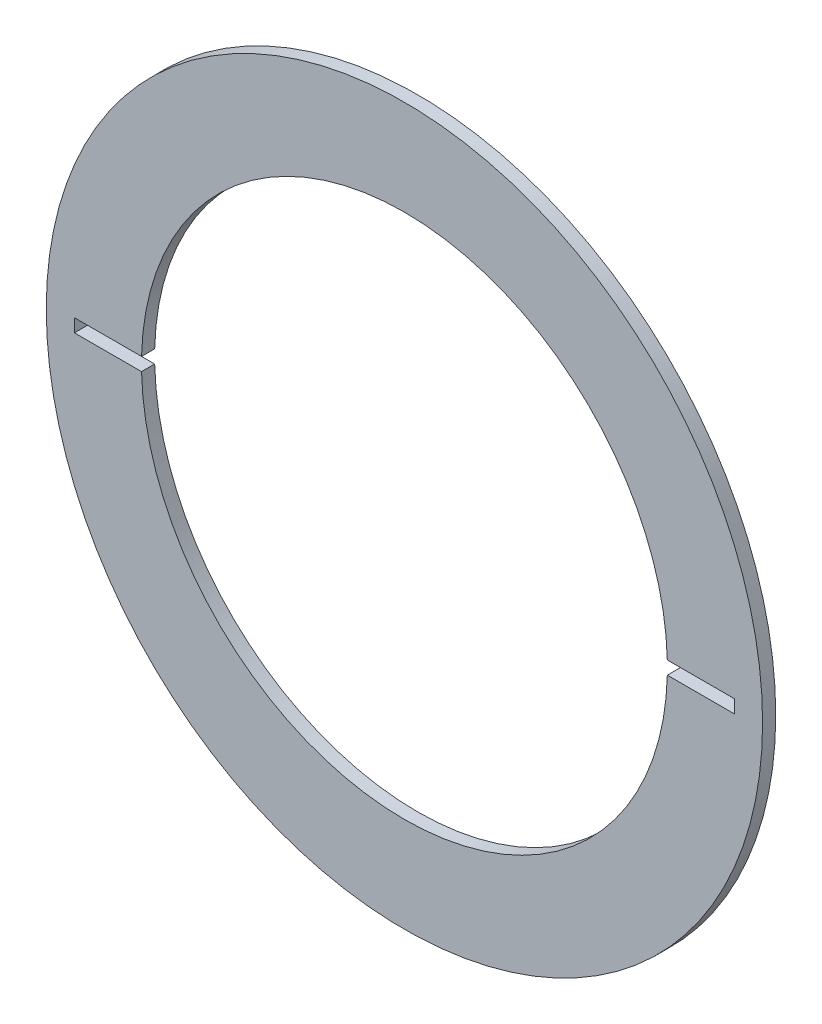
ISO-10303-21;
HEADER;
FILE_DESCRIPTION(('STEP AP214'),'2;1');
FILE_NAME('part.step','',(''),(''),'','','');
FILE_SCHEMA(('AUTOMOTIVE_DESIGN { 1 0 10303 214 1 1 1 1 }'));
ENDSEC;
DATA;
#1=APPLICATION_CONTEXT('core data for automotive mechanical design processes');
#2=APPLICATION_PROTOCOL_DEFINITION('international standard','automotive_design',2000,#1);
#3=PRODUCT_CONTEXT('',#1,'mechanical');
#4=PRODUCT('Part','Part','',(#3));
#5=PRODUCT_RELATED_PRODUCT_CATEGORY('part','',(#4));
#6=PRODUCT_DEFINITION_FORMATION('','',#4);
#7=PRODUCT_DEFINITION_CONTEXT('part definition',#1,'design');
#8=PRODUCT_DEFINITION('design','',#6,#7);
#9=PRODUCT_DEFINITION_SHAPE('','',#8);
#10=(LENGTH_UNIT() NAMED_UNIT(*) SI_UNIT(.MILLI.,.METRE.));
#11=(NAMED_UNIT(*) PLANE_ANGLE_UNIT() SI_UNIT($,.RADIAN.));
#12=(NAMED_UNIT(*) SI_UNIT($,.STERADIAN.) SOLID_ANGLE_UNIT());
#13=UNCERTAINTY_MEASURE_WITH_UNIT(LENGTH_MEASURE(1.E-05),#10,'distance_accuracy_value','');
#14=(GEOMETRIC_REPRESENTATION_CONTEXT(3) GLOBAL_UNCERTAINTY_ASSIGNED_CONTEXT((#13)) GLOBAL_UNIT_ASSIGNED_CONTEXT((#10,
#11,#12)) REPRESENTATION_CONTEXT('',''));
#15=CARTESIAN_POINT('',(0.,0.,0.));
#16=DIRECTION('',(0.,0.,1.));
#17=DIRECTION('',(1.,0.,0.));
#18=AXIS2_PLACEMENT_3D('',#15,#16,#17);
#19=CARTESIAN_POINT('',(0.,0.,1.5875));
#20=DIRECTION('',(0.,0.,-1.));
#21=DIRECTION('',(-1.,0.,0.));
#22=AXIS2_PLACEMENT_3D('',#19,#20,#21);
#23=CYLINDRICAL_SURFACE('',#22,31.75);
#24=CARTESIAN_POINT('',(0.,0.,0.));
#25=DIRECTION('',(0.,0.,1.));
#26=DIRECTION('',(1.,0.,0.));
#27=AXIS2_PLACEMENT_3D('',#24,#25,#26);
#28=CIRCLE('',#27,31.75);
#29=CARTESIAN_POINT('',(31.7400765742224,0.793750000000004,0.));
#30=VERTEX_POINT('',#29);
#31=CARTESIAN_POINT('',(-31.7400765742224,0.793749999999996,0.));
#32=VERTEX_POINT('',#31);
#33=EDGE_CURVE('E134',#30,#32,#28,.T.);
#34=ORIENTED_EDGE('',*,*,#33,.F.);
#35=DIRECTION('',(0.,0.,-1.));
#36=VECTOR('',#35,1.);
#37=CARTESIAN_POINT('',(31.7400765742224,0.793750000000004,1.5875));
#38=LINE('',#37,#36);
#39=CARTESIAN_POINT('',(31.7400765742224,0.793750000000004,1.5875));
#40=VERTEX_POINT('',#39);
#41=EDGE_CURVE('E11',#40,#30,#38,.T.);
#42=ORIENTED_EDGE('',*,*,#41,.F.);
#43=CARTESIAN_POINT('',(0.,0.,1.5875));
#44=DIRECTION('',(0.,0.,1.));
#45=DIRECTION('',(1.,0.,0.));
#46=AXIS2_PLACEMENT_3D('',#43,#44,#45);
#47=CIRCLE('',#46,31.75);
#48=CARTESIAN_POINT('',(-31.7400765742224,0.793749999999996,1.5875));
#49=VERTEX_POINT('',#48);
#50=EDGE_CURVE('E152',#40,#49,#47,.T.);
#51=ORIENTED_EDGE('',*,*,#50,.T.);
#52=DIRECTION('',(0.,0.,-1.));
#53=VECTOR('',#52,1.);
#54=CARTESIAN_POINT('',(-31.7400765742224,0.793749999999996,1.5875));
#55=LINE('',#54,#53);
#56=EDGE_CURVE('E52',#49,#32,#55,.T.);
#57=ORIENTED_EDGE('',*,*,#56,.T.);
#58=EDGE_LOOP('',(#34,#42,#51,#57));
#59=FACE_BOUND('',#58,.T.);
#60=ADVANCED_FACE('F35',(#59),#23,.F.);
#61=CARTESIAN_POINT('',(0.,0.79375,1.5875));
#62=DIRECTION('',(0.,-1.,0.));
#63=DIRECTION('',(1.,0.,0.));
#64=AXIS2_PLACEMENT_3D('',#61,#62,#63);
#65=PLANE('',#64);
#66=DIRECTION('',(-1.,0.,0.));
#67=VECTOR('',#66,1.);
#68=CARTESIAN_POINT('',(0.,0.79375,0.));
#69=LINE('',#68,#67);
#70=CARTESIAN_POINT('',(39.84498,0.793750000000005,0.));
#71=VERTEX_POINT('',#70);
#72=EDGE_CURVE('E136',#71,#30,#69,.T.);
#73=ORIENTED_EDGE('',*,*,#72,.F.);
#74=DIRECTION('',(0.,0.,-1.));
#75=VECTOR('',#74,1.);
#76=CARTESIAN_POINT('',(39.84498,0.793750000000005,1.5875));
#77=LINE('',#76,#75);
#78=CARTESIAN_POINT('',(39.84498,0.793750000000005,1.5875));
#79=VERTEX_POINT('',#78);
#80=EDGE_CURVE('E44',#79,#71,#77,.T.);
#81=ORIENTED_EDGE('',*,*,#80,.F.);
#82=DIRECTION('',(-1.,0.,0.));
#83=VECTOR('',#82,1.);
#84=CARTESIAN_POINT('',(0.,0.79375,1.5875));
#85=LINE('',#84,#83);
#86=EDGE_CURVE('E129',#79,#40,#85,.T.);
#87=ORIENTED_EDGE('',*,*,#86,.T.);
#88=ORIENTED_EDGE('',*,*,#41,.T.);
#89=EDGE_LOOP('',(#73,#81,#87,#88));
#90=FACE_BOUND('',#89,.T.);
#91=ADVANCED_FACE('F168',(#90),#65,.T.);
#92=CARTESIAN_POINT('',(39.84498,0.,1.5875));
#93=DIRECTION('',(-1.,0.,0.));
#94=DIRECTION('',(0.,0.,1.));
#95=AXIS2_PLACEMENT_3D('',#92,#93,#94);
#96=PLANE('',#95);
#97=DIRECTION('',(0.,1.,0.));
#98=VECTOR('',#97,1.);
#99=CARTESIAN_POINT('',(39.84498,0.,0.));
#100=LINE('',#99,#98);
#101=CARTESIAN_POINT('',(39.84498,-0.793749999999995,0.));
#102=VERTEX_POINT('',#101);
#103=EDGE_CURVE('E140',#102,#71,#100,.T.);
#104=ORIENTED_EDGE('',*,*,#103,.F.);
#105=DIRECTION('',(0.,0.,-1.));
#106=VECTOR('',#105,1.);
#107=CARTESIAN_POINT('',(39.84498,-0.793749999999995,1.5875));
#108=LINE('',#107,#106);
#109=CARTESIAN_POINT('',(39.84498,-0.793749999999995,1.5875));
#110=VERTEX_POINT('',#109);
#111=EDGE_CURVE('E158',#110,#102,#108,.T.);
#112=ORIENTED_EDGE('',*,*,#111,.F.);
#113=DIRECTION('',(0.,1.,0.));
#114=VECTOR('',#113,1.);
#115=CARTESIAN_POINT('',(39.84498,0.,1.5875));
#116=LINE('',#115,#114);
#117=EDGE_CURVE('E164',#110,#79,#116,.T.);
#118=ORIENTED_EDGE('',*,*,#117,.T.);
#119=ORIENTED_EDGE('',*,*,#80,.T.);
#120=EDGE_LOOP('',(#104,#112,#118,#119));
#121=FACE_BOUND('',#120,.T.);
#122=ADVANCED_FACE('F37',(#121),#96,.T.);
#123=CARTESIAN_POINT('',(0.,-0.79375,1.5875));
#124=DIRECTION('',(0.,-1.,0.));
#125=DIRECTION('',(1.,0.,0.));
#126=AXIS2_PLACEMENT_3D('',#123,#124,#125);
#127=PLANE('',#126);
#128=DIRECTION('',(-1.,0.,0.));
#129=VECTOR('',#128,1.);
#130=CARTESIAN_POINT('',(0.,-0.79375,0.));
#131=LINE('',#130,#129);
#132=CARTESIAN_POINT('',(31.7400765742224,-0.793749999999996,0.));
#133=VERTEX_POINT('',#132);
#134=EDGE_CURVE('E144',#102,#133,#131,.T.);
#135=ORIENTED_EDGE('',*,*,#134,.T.);
#136=DIRECTION('',(0.,0.,-1.));
#137=VECTOR('',#136,1.);
#138=CARTESIAN_POINT('',(31.7400765742224,-0.793749999999996,1.5875));
#139=LINE('',#138,#137);
#140=CARTESIAN_POINT('',(31.7400765742224,-0.793749999999996,1.5875));
#141=VERTEX_POINT('',#140);
#142=EDGE_CURVE('E156',#141,#133,#139,.T.);
#143=ORIENTED_EDGE('',*,*,#142,.F.);
#144=DIRECTION('',(-1.,0.,0.));
#145=VECTOR('',#144,1.);
#146=CARTESIAN_POINT('',(0.,-0.79375,1.5875));
#147=LINE('',#146,#145);
#148=EDGE_CURVE('E114',#110,#141,#147,.T.);
#149=ORIENTED_EDGE('',*,*,#148,.F.);
#150=ORIENTED_EDGE('',*,*,#111,.T.);
#151=EDGE_LOOP('',(#135,#143,#149,#150));
#152=FACE_BOUND('',#151,.T.);
#153=ADVANCED_FACE('F177',(#152),#127,.F.);
#154=CARTESIAN_POINT('',(-31.7400765742224,-0.793750000000004,0.));
#155=VERTEX_POINT('',#154);
#156=EDGE_CURVE('E137',#155,#133,#28,.T.);
#157=ORIENTED_EDGE('',*,*,#156,.F.);
#158=DIRECTION('',(0.,0.,-1.));
#159=VECTOR('',#158,1.);
#160=CARTESIAN_POINT('',(-31.7400765742224,-0.793750000000004,1.5875));
#161=LINE('',#160,#159);
#162=CARTESIAN_POINT('',(-31.7400765742224,-0.793750000000004,1.5875));
#163=VERTEX_POINT('',#162);
#164=EDGE_CURVE('E122',#163,#155,#161,.T.);
#165=ORIENTED_EDGE('',*,*,#164,.F.);
#166=EDGE_CURVE('E111',#163,#141,#47,.T.);
#167=ORIENTED_EDGE('',*,*,#166,.T.);
#168=ORIENTED_EDGE('',*,*,#142,.T.);
#169=EDGE_LOOP('',(#157,#165,#167,#168));
#170=FACE_BOUND('',#169,.T.);
#171=ADVANCED_FACE('F181',(#170),#23,.F.);
#172=CARTESIAN_POINT('',(-39.84498,-0.793750000000005,0.));
#173=VERTEX_POINT('',#172);
#174=EDGE_CURVE('E119',#155,#173,#131,.T.);
#175=ORIENTED_EDGE('',*,*,#174,.T.);
#176=DIRECTION('',(0.,0.,-1.));
#177=VECTOR('',#176,1.);
#178=CARTESIAN_POINT('',(-39.84498,-0.793750000000005,1.5875));
#179=LINE('',#178,#177);
#180=CARTESIAN_POINT('',(-39.84498,-0.793750000000005,1.5875));
#181=VERTEX_POINT('',#180);
#182=EDGE_CURVE('E116',#181,#173,#179,.T.);
#183=ORIENTED_EDGE('',*,*,#182,.F.);
#184=EDGE_CURVE('E103',#163,#181,#147,.T.);
#185=ORIENTED_EDGE('',*,*,#184,.F.);
#186=ORIENTED_EDGE('',*,*,#164,.T.);
#187=EDGE_LOOP('',(#175,#183,#185,#186));
#188=FACE_BOUND('',#187,.T.);
#189=ADVANCED_FACE('F117',(#188),#127,.F.);
#190=CARTESIAN_POINT('',(-39.84498,0.,1.5875));
#191=DIRECTION('',(-1.,0.,0.));
#192=DIRECTION('',(0.,0.,1.));
#193=AXIS2_PLACEMENT_3D('',#190,#191,#192);
#194=PLANE('',#193);
#195=DIRECTION('',(0.,1.,0.));
#196=VECTOR('',#195,1.);
#197=CARTESIAN_POINT('',(-39.84498,0.,0.));
#198=LINE('',#197,#196);
#199=CARTESIAN_POINT('',(-39.84498,0.793749999999995,0.));
#200=VERTEX_POINT('',#199);
#201=EDGE_CURVE('E147',#173,#200,#198,.T.);
#202=ORIENTED_EDGE('',*,*,#201,.T.);
#203=DIRECTION('',(0.,0.,-1.));
#204=VECTOR('',#203,1.);
#205=CARTESIAN_POINT('',(-39.84498,0.793749999999995,1.5875));
#206=LINE('',#205,#204);
#207=CARTESIAN_POINT('',(-39.84498,0.793749999999995,1.5875));
#208=VERTEX_POINT('',#207);
#209=EDGE_CURVE('E78',#208,#200,#206,.T.);
#210=ORIENTED_EDGE('',*,*,#209,.F.);
#211=DIRECTION('',(0.,1.,0.));
#212=VECTOR('',#211,1.);
#213=CARTESIAN_POINT('',(-39.84498,0.,1.5875));
#214=LINE('',#213,#212);
#215=EDGE_CURVE('E109',#181,#208,#214,.T.);
#216=ORIENTED_EDGE('',*,*,#215,.F.);
#217=ORIENTED_EDGE('',*,*,#182,.T.);
#218=EDGE_LOOP('',(#202,#210,#216,#217));
#219=FACE_BOUND('',#218,.T.);
#220=ADVANCED_FACE('F124',(#219),#194,.F.);
#221=EDGE_CURVE('E141',#32,#200,#69,.T.);
#222=ORIENTED_EDGE('',*,*,#221,.F.);
#223=ORIENTED_EDGE('',*,*,#56,.F.);
#224=EDGE_CURVE('E125',#49,#208,#85,.T.);
#225=ORIENTED_EDGE('',*,*,#224,.T.);
#226=ORIENTED_EDGE('',*,*,#209,.T.);
#227=EDGE_LOOP('',(#222,#223,#225,#226));
#228=FACE_BOUND('',#227,.T.);
#229=ADVANCED_FACE('F183',(#228),#65,.T.);
#230=CARTESIAN_POINT('',(0.,0.,1.5875));
#231=DIRECTION('',(0.,0.,-1.));
#232=DIRECTION('',(-1.,0.,0.));
#233=AXIS2_PLACEMENT_3D('',#230,#231,#232);
#234=CYLINDRICAL_SURFACE('',#233,43.2435);
#235=CARTESIAN_POINT('',(0.,0.,1.5875));
#236=DIRECTION('',(0.,0.,1.));
#237=DIRECTION('',(1.,0.,0.));
#238=AXIS2_PLACEMENT_3D('',#235,#236,#237);
#239=CIRCLE('',#238,43.2435);
#240=CARTESIAN_POINT('',(43.2435,0.,1.5875));
#241=VERTEX_POINT('',#240);
#242=EDGE_CURVE('E127',#241,#241,#239,.T.);
#243=ORIENTED_EDGE('',*,*,#242,.F.);
#244=EDGE_LOOP('',(#243));
#245=FACE_BOUND('',#244,.T.);
#246=CARTESIAN_POINT('',(0.,0.,0.));
#247=DIRECTION('',(0.,0.,1.));
#248=DIRECTION('',(1.,0.,0.));
#249=AXIS2_PLACEMENT_3D('',#246,#247,#248);
#250=CIRCLE('',#249,43.2435);
#251=CARTESIAN_POINT('',(43.2435,0.,0.));
#252=VERTEX_POINT('',#251);
#253=EDGE_CURVE('E149',#252,#252,#250,.T.);
#254=ORIENTED_EDGE('',*,*,#253,.T.);
#255=EDGE_LOOP('',(#254));
#256=FACE_BOUND('',#255,.T.);
#257=ADVANCED_FACE('F185',(#245,#256),#234,.T.);
#258=CARTESIAN_POINT('',(0.,0.,1.5875));
#259=DIRECTION('',(0.,0.,1.));
#260=DIRECTION('',(1.,0.,0.));
#261=AXIS2_PLACEMENT_3D('',#258,#259,#260);
#262=PLANE('',#261);
#263=ORIENTED_EDGE('',*,*,#50,.F.);
#264=ORIENTED_EDGE('',*,*,#86,.F.);
#265=ORIENTED_EDGE('',*,*,#117,.F.);
#266=ORIENTED_EDGE('',*,*,#148,.T.);
#267=ORIENTED_EDGE('',*,*,#166,.F.);
#268=ORIENTED_EDGE('',*,*,#184,.T.);
#269=ORIENTED_EDGE('',*,*,#215,.T.);
#270=ORIENTED_EDGE('',*,*,#224,.F.);
#271=EDGE_LOOP('',(#263,#264,#265,#266,#267,#268,#269,#270));
#272=FACE_BOUND('',#271,.T.);
#273=ORIENTED_EDGE('',*,*,#242,.T.);
#274=EDGE_LOOP('',(#273));
#275=FACE_BOUND('',#274,.T.);
#276=ADVANCED_FACE('F105',(#272,#275),#262,.T.);
#277=CARTESIAN_POINT('',(0.,0.,0.));
#278=DIRECTION('',(0.,0.,1.));
#279=DIRECTION('',(1.,0.,0.));
#280=AXIS2_PLACEMENT_3D('',#277,#278,#279);
#281=PLANE('',#280);
#282=ORIENTED_EDGE('',*,*,#33,.T.);
#283=ORIENTED_EDGE('',*,*,#221,.T.);
#284=ORIENTED_EDGE('',*,*,#201,.F.);
#285=ORIENTED_EDGE('',*,*,#174,.F.);
#286=ORIENTED_EDGE('',*,*,#156,.T.);
#287=ORIENTED_EDGE('',*,*,#134,.F.);
#288=ORIENTED_EDGE('',*,*,#103,.T.);
#289=ORIENTED_EDGE('',*,*,#72,.T.);
#290=EDGE_LOOP('',(#282,#283,#284,#285,#286,#287,#288,#289));
#291=FACE_BOUND('',#290,.T.);
#292=ORIENTED_EDGE('',*,*,#253,.F.);
#293=EDGE_LOOP('',(#292));
#294=FACE_BOUND('',#293,.T.);
#295=ADVANCED_FACE('F171',(#291,#294),#281,.F.);
#296=CLOSED_SHELL('',(#60,#91,#122,#153,#171,#189,#220,#229,#257,#276,#295));
#297=MANIFOLD_SOLID_BREP('B2',#296);
#298=ADVANCED_BREP_SHAPE_REPRESENTATION('',(#18,#297),#14);
#299=SHAPE_DEFINITION_REPRESENTATION(#9,#298);
ENDSEC;
END-ISO-10303-21;
